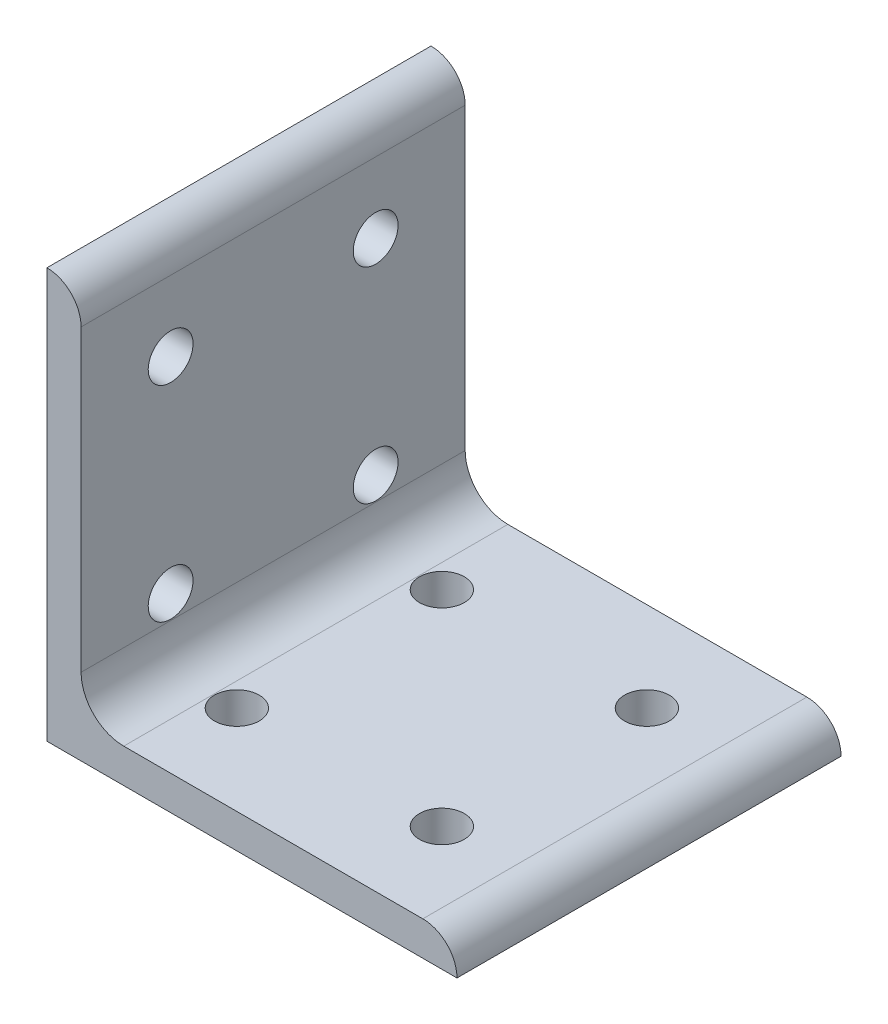
ISO-10303-21;
HEADER;
FILE_DESCRIPTION(('STEP AP214'),'2;1');
FILE_NAME('part.step','',(''),(''),'','','');
FILE_SCHEMA(('AUTOMOTIVE_DESIGN { 1 0 10303 214 1 1 1 1 }'));
ENDSEC;
DATA;
#1=APPLICATION_CONTEXT('core data for automotive mechanical design processes');
#2=APPLICATION_PROTOCOL_DEFINITION('international standard','automotive_design',2000,#1);
#3=PRODUCT_CONTEXT('',#1,'mechanical');
#4=PRODUCT('Part','Part','',(#3));
#5=PRODUCT_RELATED_PRODUCT_CATEGORY('part','',(#4));
#6=PRODUCT_DEFINITION_FORMATION('','',#4);
#7=PRODUCT_DEFINITION_CONTEXT('part definition',#1,'design');
#8=PRODUCT_DEFINITION('design','',#6,#7);
#9=PRODUCT_DEFINITION_SHAPE('','',#8);
#10=(LENGTH_UNIT() NAMED_UNIT(*) SI_UNIT(.MILLI.,.METRE.));
#11=(NAMED_UNIT(*) PLANE_ANGLE_UNIT() SI_UNIT($,.RADIAN.));
#12=(NAMED_UNIT(*) SI_UNIT($,.STERADIAN.) SOLID_ANGLE_UNIT());
#13=UNCERTAINTY_MEASURE_WITH_UNIT(LENGTH_MEASURE(1.E-05),#10,'distance_accuracy_value','');
#14=(GEOMETRIC_REPRESENTATION_CONTEXT(3) GLOBAL_UNCERTAINTY_ASSIGNED_CONTEXT((#13)) GLOBAL_UNIT_ASSIGNED_CONTEXT((#10,
#11,#12)) REPRESENTATION_CONTEXT('',''));
#15=CARTESIAN_POINT('',(0.,0.,0.));
#16=DIRECTION('',(0.,0.,1.));
#17=DIRECTION('',(1.,0.,0.));
#18=AXIS2_PLACEMENT_3D('',#15,#16,#17);
#19=CARTESIAN_POINT('',(6.35,69.85,35.687));
#20=DIRECTION('',(-1.,0.,0.));
#21=DIRECTION('',(0.,-1.,0.));
#22=AXIS2_PLACEMENT_3D('',#19,#20,#21);
#23=PLANE('',#22);
#24=CARTESIAN_POINT('',(6.34999999999999,18.653125,-19.05));
#25=DIRECTION('',(-1.,0.,0.));
#26=DIRECTION('',(0.,-1.,0.));
#27=AXIS2_PLACEMENT_3D('',#24,#25,#26);
#28=CIRCLE('',#27,4.1656);
#29=CARTESIAN_POINT('',(6.35,14.487525,-19.05));
#30=VERTEX_POINT('',#29);
#31=EDGE_CURVE('E211',#30,#30,#28,.F.);
#32=ORIENTED_EDGE('',*,*,#31,.F.);
#33=EDGE_LOOP('',(#32));
#34=FACE_BOUND('',#33,.T.);
#35=CARTESIAN_POINT('',(6.34999999999999,18.653125,19.05));
#36=DIRECTION('',(-1.,0.,0.));
#37=DIRECTION('',(0.,-1.,0.));
#38=AXIS2_PLACEMENT_3D('',#35,#36,#37);
#39=CIRCLE('',#38,4.1656);
#40=CARTESIAN_POINT('',(6.35,14.487525,19.05));
#41=VERTEX_POINT('',#40);
#42=EDGE_CURVE('E220',#41,#41,#39,.F.);
#43=ORIENTED_EDGE('',*,*,#42,.F.);
#44=EDGE_LOOP('',(#43));
#45=FACE_BOUND('',#44,.T.);
#46=DIRECTION('',(0.,1.,0.));
#47=VECTOR('',#46,1.);
#48=CARTESIAN_POINT('',(6.35,69.85,-35.687));
#49=LINE('',#48,#47);
#50=CARTESIAN_POINT('',(6.35,14.2748,-35.687));
#51=VERTEX_POINT('',#50);
#52=CARTESIAN_POINT('',(6.35,69.85,-35.687));
#53=VERTEX_POINT('',#52);
#54=EDGE_CURVE('E115',#51,#53,#49,.T.);
#55=ORIENTED_EDGE('',*,*,#54,.T.);
#56=DIRECTION('',(0.,0.,-1.));
#57=VECTOR('',#56,1.);
#58=CARTESIAN_POINT('',(6.35,69.85,35.687));
#59=LINE('',#58,#57);
#60=CARTESIAN_POINT('',(6.35,69.85,35.687));
#61=VERTEX_POINT('',#60);
#62=EDGE_CURVE('E112',#61,#53,#59,.T.);
#63=ORIENTED_EDGE('',*,*,#62,.F.);
#64=DIRECTION('',(0.,1.,0.));
#65=VECTOR('',#64,1.);
#66=CARTESIAN_POINT('',(6.35,69.85,35.687));
#67=LINE('',#66,#65);
#68=CARTESIAN_POINT('',(6.35,14.2748,35.687));
#69=VERTEX_POINT('',#68);
#70=EDGE_CURVE('E101',#69,#61,#67,.T.);
#71=ORIENTED_EDGE('',*,*,#70,.F.);
#72=DIRECTION('',(0.,0.,-1.));
#73=VECTOR('',#72,1.);
#74=CARTESIAN_POINT('',(6.35,14.2748,35.687));
#75=LINE('',#74,#73);
#76=EDGE_CURVE('E116',#69,#51,#75,.T.);
#77=ORIENTED_EDGE('',*,*,#76,.T.);
#78=EDGE_LOOP('',(#55,#63,#71,#77));
#79=FACE_BOUND('',#78,.T.);
#80=CARTESIAN_POINT('',(6.34999999999999,56.753125,19.05));
#81=DIRECTION('',(-1.,0.,0.));
#82=DIRECTION('',(0.,-1.,0.));
#83=AXIS2_PLACEMENT_3D('',#80,#81,#82);
#84=CIRCLE('',#83,4.1656);
#85=CARTESIAN_POINT('',(6.35,52.587525,19.05));
#86=VERTEX_POINT('',#85);
#87=EDGE_CURVE('E215',#86,#86,#84,.F.);
#88=ORIENTED_EDGE('',*,*,#87,.F.);
#89=EDGE_LOOP('',(#88));
#90=FACE_BOUND('',#89,.T.);
#91=CARTESIAN_POINT('',(6.34999999999999,56.753125,-19.05));
#92=DIRECTION('',(-1.,0.,0.));
#93=DIRECTION('',(0.,-1.,0.));
#94=AXIS2_PLACEMENT_3D('',#91,#92,#93);
#95=CIRCLE('',#94,4.1656);
#96=CARTESIAN_POINT('',(6.35,52.587525,-19.05));
#97=VERTEX_POINT('',#96);
#98=EDGE_CURVE('E203',#97,#97,#95,.F.);
#99=ORIENTED_EDGE('',*,*,#98,.F.);
#100=EDGE_LOOP('',(#99));
#101=FACE_BOUND('',#100,.T.);
#102=ADVANCED_FACE('F32',(#34,#45,#79,#90,#101),#23,.F.);
#103=CARTESIAN_POINT('',(0.,0.,35.687));
#104=DIRECTION('',(1.,0.,0.));
#105=DIRECTION('',(0.,0.,-1.));
#106=AXIS2_PLACEMENT_3D('',#103,#104,#105);
#107=PLANE('',#106);
#108=CARTESIAN_POINT('',(0.,18.653125,-19.05));
#109=DIRECTION('',(1.,0.,0.));
#110=DIRECTION('',(0.,0.,-1.));
#111=AXIS2_PLACEMENT_3D('',#108,#109,#110);
#112=CIRCLE('',#111,4.1656);
#113=CARTESIAN_POINT('',(0.,18.653125,-23.2156));
#114=VERTEX_POINT('',#113);
#115=EDGE_CURVE('E206',#114,#114,#112,.T.);
#116=ORIENTED_EDGE('',*,*,#115,.T.);
#117=EDGE_LOOP('',(#116));
#118=FACE_BOUND('',#117,.T.);
#119=CARTESIAN_POINT('',(0.,18.653125,19.05));
#120=DIRECTION('',(1.,0.,0.));
#121=DIRECTION('',(0.,0.,-1.));
#122=AXIS2_PLACEMENT_3D('',#119,#120,#121);
#123=CIRCLE('',#122,4.1656);
#124=CARTESIAN_POINT('',(0.,18.653125,14.8844));
#125=VERTEX_POINT('',#124);
#126=EDGE_CURVE('E218',#125,#125,#123,.T.);
#127=ORIENTED_EDGE('',*,*,#126,.T.);
#128=EDGE_LOOP('',(#127));
#129=FACE_BOUND('',#128,.T.);
#130=DIRECTION('',(0.,-1.,0.));
#131=VECTOR('',#130,1.);
#132=CARTESIAN_POINT('',(0.,0.,-35.687));
#133=LINE('',#132,#131);
#134=CARTESIAN_POINT('',(0.,76.2,-35.687));
#135=VERTEX_POINT('',#134);
#136=CARTESIAN_POINT('',(0.,0.,-35.687));
#137=VERTEX_POINT('',#136);
#138=EDGE_CURVE('E83',#135,#137,#133,.T.);
#139=ORIENTED_EDGE('',*,*,#138,.T.);
#140=DIRECTION('',(0.,0.,-1.));
#141=VECTOR('',#140,1.);
#142=CARTESIAN_POINT('',(0.,0.,35.687));
#143=LINE('',#142,#141);
#144=CARTESIAN_POINT('',(0.,0.,35.687));
#145=VERTEX_POINT('',#144);
#146=EDGE_CURVE('E121',#145,#137,#143,.T.);
#147=ORIENTED_EDGE('',*,*,#146,.F.);
#148=DIRECTION('',(0.,-1.,0.));
#149=VECTOR('',#148,1.);
#150=CARTESIAN_POINT('',(0.,0.,35.687));
#151=LINE('',#150,#149);
#152=CARTESIAN_POINT('',(0.,76.2,35.687));
#153=VERTEX_POINT('',#152);
#154=EDGE_CURVE('E51',#153,#145,#151,.T.);
#155=ORIENTED_EDGE('',*,*,#154,.F.);
#156=DIRECTION('',(0.,0.,-1.));
#157=VECTOR('',#156,1.);
#158=CARTESIAN_POINT('',(0.,76.2,35.687));
#159=LINE('',#158,#157);
#160=EDGE_CURVE('E117',#153,#135,#159,.T.);
#161=ORIENTED_EDGE('',*,*,#160,.T.);
#162=EDGE_LOOP('',(#139,#147,#155,#161));
#163=FACE_BOUND('',#162,.T.);
#164=CARTESIAN_POINT('',(0.,56.753125,19.05));
#165=DIRECTION('',(1.,0.,0.));
#166=DIRECTION('',(0.,0.,-1.));
#167=AXIS2_PLACEMENT_3D('',#164,#165,#166);
#168=CIRCLE('',#167,4.1656);
#169=CARTESIAN_POINT('',(0.,56.753125,14.8844));
#170=VERTEX_POINT('',#169);
#171=EDGE_CURVE('E198',#170,#170,#168,.T.);
#172=ORIENTED_EDGE('',*,*,#171,.T.);
#173=EDGE_LOOP('',(#172));
#174=FACE_BOUND('',#173,.T.);
#175=CARTESIAN_POINT('',(0.,56.753125,-19.05));
#176=DIRECTION('',(1.,0.,0.));
#177=DIRECTION('',(0.,0.,-1.));
#178=AXIS2_PLACEMENT_3D('',#175,#176,#177);
#179=CIRCLE('',#178,4.1656);
#180=CARTESIAN_POINT('',(0.,56.753125,-23.2156));
#181=VERTEX_POINT('',#180);
#182=EDGE_CURVE('E201',#181,#181,#179,.T.);
#183=ORIENTED_EDGE('',*,*,#182,.T.);
#184=EDGE_LOOP('',(#183));
#185=FACE_BOUND('',#184,.T.);
#186=ADVANCED_FACE('F190',(#118,#129,#163,#174,#185),#107,.F.);
#187=CARTESIAN_POINT('',(76.2,0.,35.687));
#188=DIRECTION('',(0.,1.,0.));
#189=DIRECTION('',(-1.,0.,0.));
#190=AXIS2_PLACEMENT_3D('',#187,#188,#189);
#191=PLANE('',#190);
#192=CARTESIAN_POINT('',(18.653125,0.,-19.05));
#193=DIRECTION('',(0.,1.,0.));
#194=DIRECTION('',(0.,0.,1.));
#195=AXIS2_PLACEMENT_3D('',#192,#193,#194);
#196=CIRCLE('',#195,4.1656);
#197=CARTESIAN_POINT('',(18.653125,0.,-23.2156));
#198=VERTEX_POINT('',#197);
#199=EDGE_CURVE('E155',#198,#198,#196,.T.);
#200=ORIENTED_EDGE('',*,*,#199,.T.);
#201=EDGE_LOOP('',(#200));
#202=FACE_BOUND('',#201,.T.);
#203=CARTESIAN_POINT('',(18.653125,0.,19.05));
#204=DIRECTION('',(0.,1.,0.));
#205=DIRECTION('',(0.,0.,1.));
#206=AXIS2_PLACEMENT_3D('',#203,#204,#205);
#207=CIRCLE('',#206,4.1656);
#208=CARTESIAN_POINT('',(18.653125,0.,14.8844));
#209=VERTEX_POINT('',#208);
#210=EDGE_CURVE('E149',#209,#209,#207,.T.);
#211=ORIENTED_EDGE('',*,*,#210,.T.);
#212=EDGE_LOOP('',(#211));
#213=FACE_BOUND('',#212,.T.);
#214=DIRECTION('',(1.,0.,0.));
#215=VECTOR('',#214,1.);
#216=CARTESIAN_POINT('',(76.2,0.,-35.687));
#217=LINE('',#216,#215);
#218=CARTESIAN_POINT('',(76.2,0.,-35.687));
#219=VERTEX_POINT('',#218);
#220=EDGE_CURVE('E125',#137,#219,#217,.T.);
#221=ORIENTED_EDGE('',*,*,#220,.T.);
#222=DIRECTION('',(0.,0.,-1.));
#223=VECTOR('',#222,1.);
#224=CARTESIAN_POINT('',(76.2,0.,35.687));
#225=LINE('',#224,#223);
#226=CARTESIAN_POINT('',(76.2,0.,35.687));
#227=VERTEX_POINT('',#226);
#228=EDGE_CURVE('E11',#227,#219,#225,.T.);
#229=ORIENTED_EDGE('',*,*,#228,.F.);
#230=DIRECTION('',(1.,0.,0.));
#231=VECTOR('',#230,1.);
#232=CARTESIAN_POINT('',(76.2,0.,35.687));
#233=LINE('',#232,#231);
#234=EDGE_CURVE('E138',#145,#227,#233,.T.);
#235=ORIENTED_EDGE('',*,*,#234,.F.);
#236=ORIENTED_EDGE('',*,*,#146,.T.);
#237=EDGE_LOOP('',(#221,#229,#235,#236));
#238=FACE_BOUND('',#237,.T.);
#239=CARTESIAN_POINT('',(56.753125,0.,19.05));
#240=DIRECTION('',(0.,1.,0.));
#241=DIRECTION('',(0.,0.,1.));
#242=AXIS2_PLACEMENT_3D('',#239,#240,#241);
#243=CIRCLE('',#242,4.1656);
#244=CARTESIAN_POINT('',(56.753125,0.,14.8844));
#245=VERTEX_POINT('',#244);
#246=EDGE_CURVE('E152',#245,#245,#243,.T.);
#247=ORIENTED_EDGE('',*,*,#246,.T.);
#248=EDGE_LOOP('',(#247));
#249=FACE_BOUND('',#248,.T.);
#250=CARTESIAN_POINT('',(56.753125,0.,-19.05));
#251=DIRECTION('',(0.,1.,0.));
#252=DIRECTION('',(0.,0.,1.));
#253=AXIS2_PLACEMENT_3D('',#250,#251,#252);
#254=CIRCLE('',#253,4.1656);
#255=CARTESIAN_POINT('',(56.753125,0.,-23.2156));
#256=VERTEX_POINT('',#255);
#257=EDGE_CURVE('E165',#256,#256,#254,.T.);
#258=ORIENTED_EDGE('',*,*,#257,.T.);
#259=EDGE_LOOP('',(#258));
#260=FACE_BOUND('',#259,.T.);
#261=ADVANCED_FACE('F34',(#202,#213,#238,#249,#260),#191,.F.);
#262=CARTESIAN_POINT('',(14.2748,6.35,35.687));
#263=DIRECTION('',(0.,-1.,0.));
#264=DIRECTION('',(1.,0.,0.));
#265=AXIS2_PLACEMENT_3D('',#262,#263,#264);
#266=PLANE('',#265);
#267=CARTESIAN_POINT('',(18.653125,6.35000000000001,-19.05));
#268=DIRECTION('',(0.,-1.,0.));
#269=DIRECTION('',(1.,0.,0.));
#270=AXIS2_PLACEMENT_3D('',#267,#268,#269);
#271=CIRCLE('',#270,4.1656);
#272=CARTESIAN_POINT('',(18.653125,6.35000000000002,-23.2156));
#273=VERTEX_POINT('',#272);
#274=EDGE_CURVE('E153',#273,#273,#271,.F.);
#275=ORIENTED_EDGE('',*,*,#274,.F.);
#276=EDGE_LOOP('',(#275));
#277=FACE_BOUND('',#276,.T.);
#278=CARTESIAN_POINT('',(18.653125,6.35000000000001,19.05));
#279=DIRECTION('',(0.,-1.,0.));
#280=DIRECTION('',(1.,0.,0.));
#281=AXIS2_PLACEMENT_3D('',#278,#279,#280);
#282=CIRCLE('',#281,4.1656);
#283=CARTESIAN_POINT('',(18.653125,6.35000000000002,14.8844));
#284=VERTEX_POINT('',#283);
#285=EDGE_CURVE('E129',#284,#284,#282,.F.);
#286=ORIENTED_EDGE('',*,*,#285,.F.);
#287=EDGE_LOOP('',(#286));
#288=FACE_BOUND('',#287,.T.);
#289=DIRECTION('',(-1.,0.,0.));
#290=VECTOR('',#289,1.);
#291=CARTESIAN_POINT('',(14.2748,6.35,-35.687));
#292=LINE('',#291,#290);
#293=CARTESIAN_POINT('',(69.85,6.35,-35.687));
#294=VERTEX_POINT('',#293);
#295=CARTESIAN_POINT('',(14.2748,6.35,-35.687));
#296=VERTEX_POINT('',#295);
#297=EDGE_CURVE('E131',#294,#296,#292,.T.);
#298=ORIENTED_EDGE('',*,*,#297,.T.);
#299=DIRECTION('',(0.,0.,-1.));
#300=VECTOR('',#299,1.);
#301=CARTESIAN_POINT('',(14.2748,6.35,35.687));
#302=LINE('',#301,#300);
#303=CARTESIAN_POINT('',(14.2748,6.35,35.687));
#304=VERTEX_POINT('',#303);
#305=EDGE_CURVE('E142',#304,#296,#302,.T.);
#306=ORIENTED_EDGE('',*,*,#305,.F.);
#307=DIRECTION('',(-1.,0.,0.));
#308=VECTOR('',#307,1.);
#309=CARTESIAN_POINT('',(14.2748,6.35,35.687));
#310=LINE('',#309,#308);
#311=CARTESIAN_POINT('',(69.85,6.35,35.687));
#312=VERTEX_POINT('',#311);
#313=EDGE_CURVE('E173',#312,#304,#310,.T.);
#314=ORIENTED_EDGE('',*,*,#313,.F.);
#315=DIRECTION('',(0.,0.,-1.));
#316=VECTOR('',#315,1.);
#317=CARTESIAN_POINT('',(69.85,6.35,35.687));
#318=LINE('',#317,#316);
#319=EDGE_CURVE('E42',#312,#294,#318,.T.);
#320=ORIENTED_EDGE('',*,*,#319,.T.);
#321=EDGE_LOOP('',(#298,#306,#314,#320));
#322=FACE_BOUND('',#321,.T.);
#323=CARTESIAN_POINT('',(56.753125,6.35000000000001,19.05));
#324=DIRECTION('',(0.,-1.,0.));
#325=DIRECTION('',(1.,0.,0.));
#326=AXIS2_PLACEMENT_3D('',#323,#324,#325);
#327=CIRCLE('',#326,4.1656);
#328=CARTESIAN_POINT('',(56.753125,6.35000000000002,14.8844));
#329=VERTEX_POINT('',#328);
#330=EDGE_CURVE('E150',#329,#329,#327,.F.);
#331=ORIENTED_EDGE('',*,*,#330,.F.);
#332=EDGE_LOOP('',(#331));
#333=FACE_BOUND('',#332,.T.);
#334=CARTESIAN_POINT('',(56.753125,6.35000000000001,-19.05));
#335=DIRECTION('',(0.,-1.,0.));
#336=DIRECTION('',(1.,0.,0.));
#337=AXIS2_PLACEMENT_3D('',#334,#335,#336);
#338=CIRCLE('',#337,4.1656);
#339=CARTESIAN_POINT('',(56.753125,6.35000000000002,-23.2156));
#340=VERTEX_POINT('',#339);
#341=EDGE_CURVE('E36',#340,#340,#338,.F.);
#342=ORIENTED_EDGE('',*,*,#341,.F.);
#343=EDGE_LOOP('',(#342));
#344=FACE_BOUND('',#343,.T.);
#345=ADVANCED_FACE('F177',(#277,#288,#322,#333,#344),#266,.F.);
#346=CARTESIAN_POINT('',(69.85,0.,35.687));
#347=DIRECTION('',(0.,0.,-1.));
#348=DIRECTION('',(-1.,0.,0.));
#349=AXIS2_PLACEMENT_3D('',#346,#347,#348);
#350=CYLINDRICAL_SURFACE('',#349,6.35000000000001);
#351=CARTESIAN_POINT('',(69.85,0.,-35.687));
#352=DIRECTION('',(0.,0.,1.));
#353=DIRECTION('',(1.,0.,0.));
#354=AXIS2_PLACEMENT_3D('',#351,#352,#353);
#355=CIRCLE('',#354,6.35000000000001);
#356=EDGE_CURVE('E128',#219,#294,#355,.T.);
#357=ORIENTED_EDGE('',*,*,#356,.T.);
#358=ORIENTED_EDGE('',*,*,#319,.F.);
#359=CARTESIAN_POINT('',(69.85,0.,35.687));
#360=DIRECTION('',(0.,0.,1.));
#361=DIRECTION('',(1.,0.,0.));
#362=AXIS2_PLACEMENT_3D('',#359,#360,#361);
#363=CIRCLE('',#362,6.35000000000001);
#364=EDGE_CURVE('E91',#227,#312,#363,.T.);
#365=ORIENTED_EDGE('',*,*,#364,.F.);
#366=ORIENTED_EDGE('',*,*,#228,.T.);
#367=EDGE_LOOP('',(#357,#358,#365,#366));
#368=FACE_BOUND('',#367,.T.);
#369=ADVANCED_FACE('F237',(#368),#350,.T.);
#370=CARTESIAN_POINT('',(14.2748,14.2748,35.687));
#371=DIRECTION('',(0.,0.,-1.));
#372=DIRECTION('',(-1.,0.,0.));
#373=AXIS2_PLACEMENT_3D('',#370,#371,#372);
#374=CYLINDRICAL_SURFACE('',#373,7.9248);
#375=CARTESIAN_POINT('',(14.2748,14.2748,-35.687));
#376=DIRECTION('',(0.,0.,-1.));
#377=DIRECTION('',(1.,0.,0.));
#378=AXIS2_PLACEMENT_3D('',#375,#376,#377);
#379=CIRCLE('',#378,7.9248);
#380=EDGE_CURVE('E133',#296,#51,#379,.T.);
#381=ORIENTED_EDGE('',*,*,#380,.T.);
#382=ORIENTED_EDGE('',*,*,#76,.F.);
#383=CARTESIAN_POINT('',(14.2748,14.2748,35.687));
#384=DIRECTION('',(0.,0.,-1.));
#385=DIRECTION('',(1.,0.,0.));
#386=AXIS2_PLACEMENT_3D('',#383,#384,#385);
#387=CIRCLE('',#386,7.9248);
#388=EDGE_CURVE('E107',#304,#69,#387,.T.);
#389=ORIENTED_EDGE('',*,*,#388,.F.);
#390=ORIENTED_EDGE('',*,*,#305,.T.);
#391=EDGE_LOOP('',(#381,#382,#389,#390));
#392=FACE_BOUND('',#391,.T.);
#393=ADVANCED_FACE('F182',(#392),#374,.F.);
#394=CARTESIAN_POINT('',(0.,69.85,35.687));
#395=DIRECTION('',(0.,0.,-1.));
#396=DIRECTION('',(-1.,0.,0.));
#397=AXIS2_PLACEMENT_3D('',#394,#395,#396);
#398=CYLINDRICAL_SURFACE('',#397,6.35000000000001);
#399=CARTESIAN_POINT('',(0.,69.85,-35.687));
#400=DIRECTION('',(0.,0.,1.));
#401=DIRECTION('',(1.,0.,0.));
#402=AXIS2_PLACEMENT_3D('',#399,#400,#401);
#403=CIRCLE('',#402,6.35000000000001);
#404=EDGE_CURVE('E77',#53,#135,#403,.T.);
#405=ORIENTED_EDGE('',*,*,#404,.T.);
#406=ORIENTED_EDGE('',*,*,#160,.F.);
#407=CARTESIAN_POINT('',(0.,69.85,35.687));
#408=DIRECTION('',(0.,0.,1.));
#409=DIRECTION('',(1.,0.,0.));
#410=AXIS2_PLACEMENT_3D('',#407,#408,#409);
#411=CIRCLE('',#410,6.35000000000001);
#412=EDGE_CURVE('E105',#61,#153,#411,.T.);
#413=ORIENTED_EDGE('',*,*,#412,.F.);
#414=ORIENTED_EDGE('',*,*,#62,.T.);
#415=EDGE_LOOP('',(#405,#406,#413,#414));
#416=FACE_BOUND('',#415,.T.);
#417=ADVANCED_FACE('F119',(#416),#398,.T.);
#418=CARTESIAN_POINT('',(0.,69.85,35.687));
#419=DIRECTION('',(0.,0.,1.));
#420=DIRECTION('',(1.,0.,0.));
#421=AXIS2_PLACEMENT_3D('',#418,#419,#420);
#422=PLANE('',#421);
#423=ORIENTED_EDGE('',*,*,#234,.T.);
#424=ORIENTED_EDGE('',*,*,#364,.T.);
#425=ORIENTED_EDGE('',*,*,#313,.T.);
#426=ORIENTED_EDGE('',*,*,#388,.T.);
#427=ORIENTED_EDGE('',*,*,#70,.T.);
#428=ORIENTED_EDGE('',*,*,#412,.T.);
#429=ORIENTED_EDGE('',*,*,#154,.T.);
#430=EDGE_LOOP('',(#423,#424,#425,#426,#427,#428,#429));
#431=FACE_BOUND('',#430,.T.);
#432=ADVANCED_FACE('F103',(#431),#422,.T.);
#433=CARTESIAN_POINT('',(0.,69.85,-35.687));
#434=DIRECTION('',(0.,0.,1.));
#435=DIRECTION('',(1.,0.,0.));
#436=AXIS2_PLACEMENT_3D('',#433,#434,#435);
#437=PLANE('',#436);
#438=ORIENTED_EDGE('',*,*,#220,.F.);
#439=ORIENTED_EDGE('',*,*,#138,.F.);
#440=ORIENTED_EDGE('',*,*,#404,.F.);
#441=ORIENTED_EDGE('',*,*,#54,.F.);
#442=ORIENTED_EDGE('',*,*,#380,.F.);
#443=ORIENTED_EDGE('',*,*,#297,.F.);
#444=ORIENTED_EDGE('',*,*,#356,.F.);
#445=EDGE_LOOP('',(#438,#439,#440,#441,#442,#443,#444));
#446=FACE_BOUND('',#445,.T.);
#447=ADVANCED_FACE('F185',(#446),#437,.F.);
#448=CARTESIAN_POINT('',(18.653125,76.2,19.05));
#449=DIRECTION('',(0.,-1.,0.));
#450=DIRECTION('',(0.,0.,-1.));
#451=AXIS2_PLACEMENT_3D('',#448,#449,#450);
#452=CYLINDRICAL_SURFACE('',#451,4.1656);
#453=CARTESIAN_POINT('',(18.653125,0.,14.8844));
#454=CARTESIAN_POINT('',(18.653125,0.0661458333333318,14.8844));
#455=CARTESIAN_POINT('',(18.653125,0.132291666666664,14.8844));
#456=CARTESIAN_POINT('',(18.653125,0.264583333333332,14.8844));
#457=CARTESIAN_POINT('',(18.653125,0.330729166666668,14.8844));
#458=CARTESIAN_POINT('',(18.653125,0.463020833333337,14.8844));
#459=CARTESIAN_POINT('',(18.653125,0.529166666666669,14.8844));
#460=CARTESIAN_POINT('',(18.653125,0.661458333333337,14.8844));
#461=CARTESIAN_POINT('',(18.653125,0.727604166666673,14.8844));
#462=CARTESIAN_POINT('',(18.653125,0.859895833333342,14.8844));
#463=CARTESIAN_POINT('',(18.653125,0.926041666666673,14.8844));
#464=CARTESIAN_POINT('',(18.653125,1.05833333333334,14.8844));
#465=CARTESIAN_POINT('',(18.653125,1.12447916666667,14.8844));
#466=CARTESIAN_POINT('',(18.653125,1.25677083333334,14.8844));
#467=CARTESIAN_POINT('',(18.653125,1.32291666666667,14.8844));
#468=CARTESIAN_POINT('',(18.653125,1.45520833333334,14.8844));
#469=CARTESIAN_POINT('',(18.653125,1.52135416666667,14.8844));
#470=CARTESIAN_POINT('',(18.653125,1.65364583333334,14.8844));
#471=CARTESIAN_POINT('',(18.653125,1.71979166666667,14.8844));
#472=CARTESIAN_POINT('',(18.653125,1.85208333333334,14.8844));
#473=CARTESIAN_POINT('',(18.653125,1.91822916666667,14.8844));
#474=CARTESIAN_POINT('',(18.653125,2.05052083333334,14.8844));
#475=CARTESIAN_POINT('',(18.653125,2.11666666666667,14.8844));
#476=CARTESIAN_POINT('',(18.653125,2.24895833333334,14.8844));
#477=CARTESIAN_POINT('',(18.653125,2.31510416666667,14.8844));
#478=CARTESIAN_POINT('',(18.653125,2.44739583333334,14.8844));
#479=CARTESIAN_POINT('',(18.653125,2.51354166666667,14.8844));
#480=CARTESIAN_POINT('',(18.653125,2.64583333333334,14.8844));
#481=CARTESIAN_POINT('',(18.653125,2.71197916666667,14.8844));
#482=CARTESIAN_POINT('',(18.653125,2.84427083333334,14.8844));
#483=CARTESIAN_POINT('',(18.653125,2.91041666666668,14.8844));
#484=CARTESIAN_POINT('',(18.653125,3.04270833333335,14.8844));
#485=CARTESIAN_POINT('',(18.653125,3.10885416666668,14.8844));
#486=CARTESIAN_POINT('',(18.653125,3.24114583333334,14.8844));
#487=CARTESIAN_POINT('',(18.653125,3.30729166666667,14.8844));
#488=CARTESIAN_POINT('',(18.653125,3.43958333333334,14.8844));
#489=CARTESIAN_POINT('',(18.653125,3.50572916666668,14.8844));
#490=CARTESIAN_POINT('',(18.653125,3.63802083333335,14.8844));
#491=CARTESIAN_POINT('',(18.653125,3.70416666666668,14.8844));
#492=CARTESIAN_POINT('',(18.653125,3.83645833333335,14.8844));
#493=CARTESIAN_POINT('',(18.653125,3.90260416666668,14.8844));
#494=CARTESIAN_POINT('',(18.653125,4.03489583333335,14.8844));
#495=CARTESIAN_POINT('',(18.653125,4.10104166666668,14.8844));
#496=CARTESIAN_POINT('',(18.653125,4.23333333333335,14.8844));
#497=CARTESIAN_POINT('',(18.653125,4.29947916666668,14.8844));
#498=CARTESIAN_POINT('',(18.653125,4.43177083333335,14.8844));
#499=CARTESIAN_POINT('',(18.653125,4.49791666666668,14.8844));
#500=CARTESIAN_POINT('',(18.653125,4.63020833333335,14.8844));
#501=CARTESIAN_POINT('',(18.653125,4.69635416666668,14.8844));
#502=CARTESIAN_POINT('',(18.653125,4.82864583333335,14.8844));
#503=CARTESIAN_POINT('',(18.653125,4.89479166666668,14.8844));
#504=CARTESIAN_POINT('',(18.653125,5.02708333333335,14.8844));
#505=CARTESIAN_POINT('',(18.653125,5.09322916666668,14.8844));
#506=CARTESIAN_POINT('',(18.653125,5.22552083333335,14.8844));
#507=CARTESIAN_POINT('',(18.653125,5.29166666666668,14.8844));
#508=CARTESIAN_POINT('',(18.653125,5.42395833333335,14.8844));
#509=CARTESIAN_POINT('',(18.653125,5.49010416666668,14.8844));
#510=CARTESIAN_POINT('',(18.653125,5.62239583333335,14.8844));
#511=CARTESIAN_POINT('',(18.653125,5.68854166666669,14.8844));
#512=CARTESIAN_POINT('',(18.653125,5.82083333333335,14.8844));
#513=CARTESIAN_POINT('',(18.653125,5.88697916666669,14.8844));
#514=CARTESIAN_POINT('',(18.653125,6.01927083333335,14.8844));
#515=CARTESIAN_POINT('',(18.653125,6.08541666666669,14.8844));
#516=CARTESIAN_POINT('',(18.653125,6.21770833333336,14.8844));
#517=CARTESIAN_POINT('',(18.653125,6.28385416666669,14.8844));
#518=CARTESIAN_POINT('',(18.653125,6.35000000000002,14.8844));
#519=B_SPLINE_CURVE_WITH_KNOTS('',3,(#453,#454,#455,#456,#457,#458,#459,#460,#461,#462,#463,
#464,#465,#466,#467,#468,#469,#470,#471,#472,#473,#474,#475,#476,#477,#478,#479,#480,#481,#482,
#483,#484,#485,#486,#487,#488,#489,#490,#491,#492,#493,#494,#495,#496,#497,#498,#499,#500,#501,
#502,#503,#504,#505,#506,#507,#508,#509,#510,#511,#512,#513,#514,#515,#516,#517,#518),
.UNSPECIFIED.,.F.,.F.,(4,2,2,2,2,2,2,2,2,2,2,2,2,2,2,2,2,2,2,2,2,2,2,2,2,2,2,2,2,2,2,2,4),(0.,
0.198437499999995,0.396875000000005,0.5953125,0.79375000000001,0.992187500000005,1.190625,
1.38906250000001,1.58750000000001,1.7859375,1.98437500000001,2.18281250000001,2.38125,
2.57968750000001,2.77812500000001,2.97656250000002,3.17500000000001,3.37343750000001,
3.57187500000002,3.77031250000001,3.96875000000002,4.16718750000002,4.36562500000001,
4.56406250000002,4.76250000000002,4.96093750000001,5.15937500000002,5.35781250000002,
5.55625000000001,5.75468750000002,5.95312500000002,6.15156250000003,6.35000000000002),.UNSPECIFIED.);
#520=EDGE_CURVE('BSEAM265',#209,#284,#519,.T.);
#521=ORIENTED_EDGE('',*,*,#210,.F.);
#522=ORIENTED_EDGE('',*,*,#285,.T.);
#523=ORIENTED_EDGE('',*,*,#520,.T.);
#524=ORIENTED_EDGE('',*,*,#520,.F.);
#525=EDGE_LOOP('',(#521,#523,#522,#524));
#526=FACE_BOUND('',#525,.T.);
#527=ADVANCED_FACE('F265',(#526),#452,.F.);
#528=CARTESIAN_POINT('',(56.753125,76.2,19.05));
#529=DIRECTION('',(0.,-1.,0.));
#530=DIRECTION('',(0.,0.,-1.));
#531=AXIS2_PLACEMENT_3D('',#528,#529,#530);
#532=CYLINDRICAL_SURFACE('',#531,4.1656);
#533=CARTESIAN_POINT('',(56.753125,0.,14.8844));
#534=CARTESIAN_POINT('',(56.753125,0.0661458333333318,14.8844));
#535=CARTESIAN_POINT('',(56.753125,0.132291666666664,14.8844));
#536=CARTESIAN_POINT('',(56.753125,0.264583333333332,14.8844));
#537=CARTESIAN_POINT('',(56.753125,0.330729166666668,14.8844));
#538=CARTESIAN_POINT('',(56.753125,0.463020833333337,14.8844));
#539=CARTESIAN_POINT('',(56.753125,0.529166666666669,14.8844));
#540=CARTESIAN_POINT('',(56.753125,0.661458333333337,14.8844));
#541=CARTESIAN_POINT('',(56.753125,0.727604166666673,14.8844));
#542=CARTESIAN_POINT('',(56.753125,0.859895833333342,14.8844));
#543=CARTESIAN_POINT('',(56.753125,0.926041666666673,14.8844));
#544=CARTESIAN_POINT('',(56.753125,1.05833333333334,14.8844));
#545=CARTESIAN_POINT('',(56.753125,1.12447916666667,14.8844));
#546=CARTESIAN_POINT('',(56.753125,1.25677083333334,14.8844));
#547=CARTESIAN_POINT('',(56.753125,1.32291666666667,14.8844));
#548=CARTESIAN_POINT('',(56.753125,1.45520833333334,14.8844));
#549=CARTESIAN_POINT('',(56.753125,1.52135416666667,14.8844));
#550=CARTESIAN_POINT('',(56.753125,1.65364583333334,14.8844));
#551=CARTESIAN_POINT('',(56.753125,1.71979166666667,14.8844));
#552=CARTESIAN_POINT('',(56.753125,1.85208333333334,14.8844));
#553=CARTESIAN_POINT('',(56.753125,1.91822916666667,14.8844));
#554=CARTESIAN_POINT('',(56.753125,2.05052083333334,14.8844));
#555=CARTESIAN_POINT('',(56.753125,2.11666666666667,14.8844));
#556=CARTESIAN_POINT('',(56.753125,2.24895833333334,14.8844));
#557=CARTESIAN_POINT('',(56.753125,2.31510416666667,14.8844));
#558=CARTESIAN_POINT('',(56.753125,2.44739583333334,14.8844));
#559=CARTESIAN_POINT('',(56.753125,2.51354166666667,14.8844));
#560=CARTESIAN_POINT('',(56.753125,2.64583333333334,14.8844));
#561=CARTESIAN_POINT('',(56.753125,2.71197916666667,14.8844));
#562=CARTESIAN_POINT('',(56.753125,2.84427083333334,14.8844));
#563=CARTESIAN_POINT('',(56.753125,2.91041666666668,14.8844));
#564=CARTESIAN_POINT('',(56.753125,3.04270833333335,14.8844));
#565=CARTESIAN_POINT('',(56.753125,3.10885416666668,14.8844));
#566=CARTESIAN_POINT('',(56.753125,3.24114583333334,14.8844));
#567=CARTESIAN_POINT('',(56.753125,3.30729166666667,14.8844));
#568=CARTESIAN_POINT('',(56.753125,3.43958333333334,14.8844));
#569=CARTESIAN_POINT('',(56.753125,3.50572916666668,14.8844));
#570=CARTESIAN_POINT('',(56.753125,3.63802083333335,14.8844));
#571=CARTESIAN_POINT('',(56.753125,3.70416666666668,14.8844));
#572=CARTESIAN_POINT('',(56.753125,3.83645833333335,14.8844));
#573=CARTESIAN_POINT('',(56.753125,3.90260416666668,14.8844));
#574=CARTESIAN_POINT('',(56.753125,4.03489583333335,14.8844));
#575=CARTESIAN_POINT('',(56.753125,4.10104166666668,14.8844));
#576=CARTESIAN_POINT('',(56.753125,4.23333333333335,14.8844));
#577=CARTESIAN_POINT('',(56.753125,4.29947916666668,14.8844));
#578=CARTESIAN_POINT('',(56.753125,4.43177083333335,14.8844));
#579=CARTESIAN_POINT('',(56.753125,4.49791666666668,14.8844));
#580=CARTESIAN_POINT('',(56.753125,4.63020833333335,14.8844));
#581=CARTESIAN_POINT('',(56.753125,4.69635416666668,14.8844));
#582=CARTESIAN_POINT('',(56.753125,4.82864583333335,14.8844));
#583=CARTESIAN_POINT('',(56.753125,4.89479166666668,14.8844));
#584=CARTESIAN_POINT('',(56.753125,5.02708333333335,14.8844));
#585=CARTESIAN_POINT('',(56.753125,5.09322916666668,14.8844));
#586=CARTESIAN_POINT('',(56.753125,5.22552083333335,14.8844));
#587=CARTESIAN_POINT('',(56.753125,5.29166666666668,14.8844));
#588=CARTESIAN_POINT('',(56.753125,5.42395833333335,14.8844));
#589=CARTESIAN_POINT('',(56.753125,5.49010416666668,14.8844));
#590=CARTESIAN_POINT('',(56.753125,5.62239583333335,14.8844));
#591=CARTESIAN_POINT('',(56.753125,5.68854166666669,14.8844));
#592=CARTESIAN_POINT('',(56.753125,5.82083333333335,14.8844));
#593=CARTESIAN_POINT('',(56.753125,5.88697916666669,14.8844));
#594=CARTESIAN_POINT('',(56.753125,6.01927083333335,14.8844));
#595=CARTESIAN_POINT('',(56.753125,6.08541666666669,14.8844));
#596=CARTESIAN_POINT('',(56.753125,6.21770833333336,14.8844));
#597=CARTESIAN_POINT('',(56.753125,6.28385416666669,14.8844));
#598=CARTESIAN_POINT('',(56.753125,6.35000000000002,14.8844));
#599=B_SPLINE_CURVE_WITH_KNOTS('',3,(#533,#534,#535,#536,#537,#538,#539,#540,#541,#542,#543,
#544,#545,#546,#547,#548,#549,#550,#551,#552,#553,#554,#555,#556,#557,#558,#559,#560,#561,#562,
#563,#564,#565,#566,#567,#568,#569,#570,#571,#572,#573,#574,#575,#576,#577,#578,#579,#580,#581,
#582,#583,#584,#585,#586,#587,#588,#589,#590,#591,#592,#593,#594,#595,#596,#597,#598),
.UNSPECIFIED.,.F.,.F.,(4,2,2,2,2,2,2,2,2,2,2,2,2,2,2,2,2,2,2,2,2,2,2,2,2,2,2,2,2,2,2,2,4),(0.,
0.198437499999995,0.396875000000005,0.5953125,0.79375000000001,0.992187500000005,1.190625,
1.38906250000001,1.58750000000001,1.7859375,1.98437500000001,2.18281250000001,2.38125,
2.57968750000001,2.77812500000001,2.97656250000002,3.17500000000001,3.37343750000001,
3.57187500000002,3.77031250000001,3.96875000000002,4.16718750000002,4.36562500000001,
4.56406250000002,4.76250000000002,4.96093750000001,5.15937500000002,5.35781250000002,
5.55625000000001,5.75468750000002,5.95312500000002,6.15156250000003,6.35000000000002),.UNSPECIFIED.);
#600=EDGE_CURVE('BSEAM270',#245,#329,#599,.T.);
#601=ORIENTED_EDGE('',*,*,#246,.F.);
#602=ORIENTED_EDGE('',*,*,#330,.T.);
#603=ORIENTED_EDGE('',*,*,#600,.T.);
#604=ORIENTED_EDGE('',*,*,#600,.F.);
#605=EDGE_LOOP('',(#601,#603,#602,#604));
#606=FACE_BOUND('',#605,.T.);
#607=ADVANCED_FACE('F270',(#606),#532,.F.);
#608=CARTESIAN_POINT('',(18.653125,76.2,-19.05));
#609=DIRECTION('',(0.,-1.,0.));
#610=DIRECTION('',(0.,0.,-1.));
#611=AXIS2_PLACEMENT_3D('',#608,#609,#610);
#612=CYLINDRICAL_SURFACE('',#611,4.1656);
#613=CARTESIAN_POINT('',(18.653125,0.,-23.2156));
#614=CARTESIAN_POINT('',(18.653125,0.0661458333333318,-23.2156));
#615=CARTESIAN_POINT('',(18.653125,0.132291666666664,-23.2156));
#616=CARTESIAN_POINT('',(18.653125,0.264583333333332,-23.2156));
#617=CARTESIAN_POINT('',(18.653125,0.330729166666668,-23.2156));
#618=CARTESIAN_POINT('',(18.653125,0.463020833333337,-23.2156));
#619=CARTESIAN_POINT('',(18.653125,0.529166666666669,-23.2156));
#620=CARTESIAN_POINT('',(18.653125,0.661458333333337,-23.2156));
#621=CARTESIAN_POINT('',(18.653125,0.727604166666673,-23.2156));
#622=CARTESIAN_POINT('',(18.653125,0.859895833333342,-23.2156));
#623=CARTESIAN_POINT('',(18.653125,0.926041666666673,-23.2156));
#624=CARTESIAN_POINT('',(18.653125,1.05833333333334,-23.2156));
#625=CARTESIAN_POINT('',(18.653125,1.12447916666667,-23.2156));
#626=CARTESIAN_POINT('',(18.653125,1.25677083333334,-23.2156));
#627=CARTESIAN_POINT('',(18.653125,1.32291666666667,-23.2156));
#628=CARTESIAN_POINT('',(18.653125,1.45520833333334,-23.2156));
#629=CARTESIAN_POINT('',(18.653125,1.52135416666667,-23.2156));
#630=CARTESIAN_POINT('',(18.653125,1.65364583333334,-23.2156));
#631=CARTESIAN_POINT('',(18.653125,1.71979166666667,-23.2156));
#632=CARTESIAN_POINT('',(18.653125,1.85208333333334,-23.2156));
#633=CARTESIAN_POINT('',(18.653125,1.91822916666667,-23.2156));
#634=CARTESIAN_POINT('',(18.653125,2.05052083333334,-23.2156));
#635=CARTESIAN_POINT('',(18.653125,2.11666666666667,-23.2156));
#636=CARTESIAN_POINT('',(18.653125,2.24895833333334,-23.2156));
#637=CARTESIAN_POINT('',(18.653125,2.31510416666667,-23.2156));
#638=CARTESIAN_POINT('',(18.653125,2.44739583333334,-23.2156));
#639=CARTESIAN_POINT('',(18.653125,2.51354166666667,-23.2156));
#640=CARTESIAN_POINT('',(18.653125,2.64583333333334,-23.2156));
#641=CARTESIAN_POINT('',(18.653125,2.71197916666667,-23.2156));
#642=CARTESIAN_POINT('',(18.653125,2.84427083333334,-23.2156));
#643=CARTESIAN_POINT('',(18.653125,2.91041666666668,-23.2156));
#644=CARTESIAN_POINT('',(18.653125,3.04270833333335,-23.2156));
#645=CARTESIAN_POINT('',(18.653125,3.10885416666668,-23.2156));
#646=CARTESIAN_POINT('',(18.653125,3.24114583333334,-23.2156));
#647=CARTESIAN_POINT('',(18.653125,3.30729166666667,-23.2156));
#648=CARTESIAN_POINT('',(18.653125,3.43958333333334,-23.2156));
#649=CARTESIAN_POINT('',(18.653125,3.50572916666668,-23.2156));
#650=CARTESIAN_POINT('',(18.653125,3.63802083333335,-23.2156));
#651=CARTESIAN_POINT('',(18.653125,3.70416666666668,-23.2156));
#652=CARTESIAN_POINT('',(18.653125,3.83645833333335,-23.2156));
#653=CARTESIAN_POINT('',(18.653125,3.90260416666668,-23.2156));
#654=CARTESIAN_POINT('',(18.653125,4.03489583333335,-23.2156));
#655=CARTESIAN_POINT('',(18.653125,4.10104166666668,-23.2156));
#656=CARTESIAN_POINT('',(18.653125,4.23333333333335,-23.2156));
#657=CARTESIAN_POINT('',(18.653125,4.29947916666668,-23.2156));
#658=CARTESIAN_POINT('',(18.653125,4.43177083333335,-23.2156));
#659=CARTESIAN_POINT('',(18.653125,4.49791666666668,-23.2156));
#660=CARTESIAN_POINT('',(18.653125,4.63020833333335,-23.2156));
#661=CARTESIAN_POINT('',(18.653125,4.69635416666668,-23.2156));
#662=CARTESIAN_POINT('',(18.653125,4.82864583333335,-23.2156));
#663=CARTESIAN_POINT('',(18.653125,4.89479166666668,-23.2156));
#664=CARTESIAN_POINT('',(18.653125,5.02708333333335,-23.2156));
#665=CARTESIAN_POINT('',(18.653125,5.09322916666668,-23.2156));
#666=CARTESIAN_POINT('',(18.653125,5.22552083333335,-23.2156));
#667=CARTESIAN_POINT('',(18.653125,5.29166666666668,-23.2156));
#668=CARTESIAN_POINT('',(18.653125,5.42395833333335,-23.2156));
#669=CARTESIAN_POINT('',(18.653125,5.49010416666668,-23.2156));
#670=CARTESIAN_POINT('',(18.653125,5.62239583333335,-23.2156));
#671=CARTESIAN_POINT('',(18.653125,5.68854166666669,-23.2156));
#672=CARTESIAN_POINT('',(18.653125,5.82083333333335,-23.2156));
#673=CARTESIAN_POINT('',(18.653125,5.88697916666669,-23.2156));
#674=CARTESIAN_POINT('',(18.653125,6.01927083333335,-23.2156));
#675=CARTESIAN_POINT('',(18.653125,6.08541666666669,-23.2156));
#676=CARTESIAN_POINT('',(18.653125,6.21770833333336,-23.2156));
#677=CARTESIAN_POINT('',(18.653125,6.28385416666669,-23.2156));
#678=CARTESIAN_POINT('',(18.653125,6.35000000000002,-23.2156));
#679=B_SPLINE_CURVE_WITH_KNOTS('',3,(#613,#614,#615,#616,#617,#618,#619,#620,#621,#622,#623,
#624,#625,#626,#627,#628,#629,#630,#631,#632,#633,#634,#635,#636,#637,#638,#639,#640,#641,#642,
#643,#644,#645,#646,#647,#648,#649,#650,#651,#652,#653,#654,#655,#656,#657,#658,#659,#660,#661,
#662,#663,#664,#665,#666,#667,#668,#669,#670,#671,#672,#673,#674,#675,#676,#677,#678),
.UNSPECIFIED.,.F.,.F.,(4,2,2,2,2,2,2,2,2,2,2,2,2,2,2,2,2,2,2,2,2,2,2,2,2,2,2,2,2,2,2,2,4),(0.,
0.198437499999995,0.396875000000005,0.5953125,0.79375000000001,0.992187500000005,1.190625,
1.38906250000001,1.58750000000001,1.7859375,1.98437500000001,2.18281250000001,2.38125,
2.57968750000001,2.77812500000001,2.97656250000002,3.17500000000001,3.37343750000001,
3.57187500000002,3.77031250000001,3.96875000000002,4.16718750000002,4.36562500000001,
4.56406250000002,4.76250000000002,4.96093750000001,5.15937500000002,5.35781250000002,
5.55625000000001,5.75468750000002,5.95312500000002,6.15156250000003,6.35000000000002),.UNSPECIFIED.);
#680=EDGE_CURVE('BSEAM232',#198,#273,#679,.T.);
#681=ORIENTED_EDGE('',*,*,#199,.F.);
#682=ORIENTED_EDGE('',*,*,#274,.T.);
#683=ORIENTED_EDGE('',*,*,#680,.T.);
#684=ORIENTED_EDGE('',*,*,#680,.F.);
#685=EDGE_LOOP('',(#681,#683,#682,#684));
#686=FACE_BOUND('',#685,.T.);
#687=ADVANCED_FACE('F232',(#686),#612,.F.);
#688=CARTESIAN_POINT('',(56.753125,76.2,-19.05));
#689=DIRECTION('',(0.,-1.,0.));
#690=DIRECTION('',(0.,0.,-1.));
#691=AXIS2_PLACEMENT_3D('',#688,#689,#690);
#692=CYLINDRICAL_SURFACE('',#691,4.1656);
#693=CARTESIAN_POINT('',(56.753125,0.,-23.2156));
#694=CARTESIAN_POINT('',(56.753125,0.0661458333333318,-23.2156));
#695=CARTESIAN_POINT('',(56.753125,0.132291666666664,-23.2156));
#696=CARTESIAN_POINT('',(56.753125,0.264583333333332,-23.2156));
#697=CARTESIAN_POINT('',(56.753125,0.330729166666668,-23.2156));
#698=CARTESIAN_POINT('',(56.753125,0.463020833333337,-23.2156));
#699=CARTESIAN_POINT('',(56.753125,0.529166666666669,-23.2156));
#700=CARTESIAN_POINT('',(56.753125,0.661458333333337,-23.2156));
#701=CARTESIAN_POINT('',(56.753125,0.727604166666673,-23.2156));
#702=CARTESIAN_POINT('',(56.753125,0.859895833333342,-23.2156));
#703=CARTESIAN_POINT('',(56.753125,0.926041666666673,-23.2156));
#704=CARTESIAN_POINT('',(56.753125,1.05833333333334,-23.2156));
#705=CARTESIAN_POINT('',(56.753125,1.12447916666667,-23.2156));
#706=CARTESIAN_POINT('',(56.753125,1.25677083333334,-23.2156));
#707=CARTESIAN_POINT('',(56.753125,1.32291666666667,-23.2156));
#708=CARTESIAN_POINT('',(56.753125,1.45520833333334,-23.2156));
#709=CARTESIAN_POINT('',(56.753125,1.52135416666667,-23.2156));
#710=CARTESIAN_POINT('',(56.753125,1.65364583333334,-23.2156));
#711=CARTESIAN_POINT('',(56.753125,1.71979166666667,-23.2156));
#712=CARTESIAN_POINT('',(56.753125,1.85208333333334,-23.2156));
#713=CARTESIAN_POINT('',(56.753125,1.91822916666667,-23.2156));
#714=CARTESIAN_POINT('',(56.753125,2.05052083333334,-23.2156));
#715=CARTESIAN_POINT('',(56.753125,2.11666666666667,-23.2156));
#716=CARTESIAN_POINT('',(56.753125,2.24895833333334,-23.2156));
#717=CARTESIAN_POINT('',(56.753125,2.31510416666667,-23.2156));
#718=CARTESIAN_POINT('',(56.753125,2.44739583333334,-23.2156));
#719=CARTESIAN_POINT('',(56.753125,2.51354166666667,-23.2156));
#720=CARTESIAN_POINT('',(56.753125,2.64583333333334,-23.2156));
#721=CARTESIAN_POINT('',(56.753125,2.71197916666667,-23.2156));
#722=CARTESIAN_POINT('',(56.753125,2.84427083333334,-23.2156));
#723=CARTESIAN_POINT('',(56.753125,2.91041666666668,-23.2156));
#724=CARTESIAN_POINT('',(56.753125,3.04270833333335,-23.2156));
#725=CARTESIAN_POINT('',(56.753125,3.10885416666668,-23.2156));
#726=CARTESIAN_POINT('',(56.753125,3.24114583333334,-23.2156));
#727=CARTESIAN_POINT('',(56.753125,3.30729166666667,-23.2156));
#728=CARTESIAN_POINT('',(56.753125,3.43958333333334,-23.2156));
#729=CARTESIAN_POINT('',(56.753125,3.50572916666668,-23.2156));
#730=CARTESIAN_POINT('',(56.753125,3.63802083333335,-23.2156));
#731=CARTESIAN_POINT('',(56.753125,3.70416666666668,-23.2156));
#732=CARTESIAN_POINT('',(56.753125,3.83645833333335,-23.2156));
#733=CARTESIAN_POINT('',(56.753125,3.90260416666668,-23.2156));
#734=CARTESIAN_POINT('',(56.753125,4.03489583333335,-23.2156));
#735=CARTESIAN_POINT('',(56.753125,4.10104166666668,-23.2156));
#736=CARTESIAN_POINT('',(56.753125,4.23333333333335,-23.2156));
#737=CARTESIAN_POINT('',(56.753125,4.29947916666668,-23.2156));
#738=CARTESIAN_POINT('',(56.753125,4.43177083333335,-23.2156));
#739=CARTESIAN_POINT('',(56.753125,4.49791666666668,-23.2156));
#740=CARTESIAN_POINT('',(56.753125,4.63020833333335,-23.2156));
#741=CARTESIAN_POINT('',(56.753125,4.69635416666668,-23.2156));
#742=CARTESIAN_POINT('',(56.753125,4.82864583333335,-23.2156));
#743=CARTESIAN_POINT('',(56.753125,4.89479166666668,-23.2156));
#744=CARTESIAN_POINT('',(56.753125,5.02708333333335,-23.2156));
#745=CARTESIAN_POINT('',(56.753125,5.09322916666668,-23.2156));
#746=CARTESIAN_POINT('',(56.753125,5.22552083333335,-23.2156));
#747=CARTESIAN_POINT('',(56.753125,5.29166666666668,-23.2156));
#748=CARTESIAN_POINT('',(56.753125,5.42395833333335,-23.2156));
#749=CARTESIAN_POINT('',(56.753125,5.49010416666668,-23.2156));
#750=CARTESIAN_POINT('',(56.753125,5.62239583333335,-23.2156));
#751=CARTESIAN_POINT('',(56.753125,5.68854166666669,-23.2156));
#752=CARTESIAN_POINT('',(56.753125,5.82083333333335,-23.2156));
#753=CARTESIAN_POINT('',(56.753125,5.88697916666669,-23.2156));
#754=CARTESIAN_POINT('',(56.753125,6.01927083333335,-23.2156));
#755=CARTESIAN_POINT('',(56.753125,6.08541666666669,-23.2156));
#756=CARTESIAN_POINT('',(56.753125,6.21770833333336,-23.2156));
#757=CARTESIAN_POINT('',(56.753125,6.28385416666669,-23.2156));
#758=CARTESIAN_POINT('',(56.753125,6.35000000000002,-23.2156));
#759=B_SPLINE_CURVE_WITH_KNOTS('',3,(#693,#694,#695,#696,#697,#698,#699,#700,#701,#702,#703,
#704,#705,#706,#707,#708,#709,#710,#711,#712,#713,#714,#715,#716,#717,#718,#719,#720,#721,#722,
#723,#724,#725,#726,#727,#728,#729,#730,#731,#732,#733,#734,#735,#736,#737,#738,#739,#740,#741,
#742,#743,#744,#745,#746,#747,#748,#749,#750,#751,#752,#753,#754,#755,#756,#757,#758),
.UNSPECIFIED.,.F.,.F.,(4,2,2,2,2,2,2,2,2,2,2,2,2,2,2,2,2,2,2,2,2,2,2,2,2,2,2,2,2,2,2,2,4),(0.,
0.198437499999995,0.396875000000005,0.5953125,0.79375000000001,0.992187500000005,1.190625,
1.38906250000001,1.58750000000001,1.7859375,1.98437500000001,2.18281250000001,2.38125,
2.57968750000001,2.77812500000001,2.97656250000002,3.17500000000001,3.37343750000001,
3.57187500000002,3.77031250000001,3.96875000000002,4.16718750000002,4.36562500000001,
4.56406250000002,4.76250000000002,4.96093750000001,5.15937500000002,5.35781250000002,
5.55625000000001,5.75468750000002,5.95312500000002,6.15156250000003,6.35000000000002),.UNSPECIFIED.);
#760=EDGE_CURVE('BSEAM228',#256,#340,#759,.T.);
#761=ORIENTED_EDGE('',*,*,#257,.F.);
#762=ORIENTED_EDGE('',*,*,#341,.T.);
#763=ORIENTED_EDGE('',*,*,#760,.T.);
#764=ORIENTED_EDGE('',*,*,#760,.F.);
#765=EDGE_LOOP('',(#761,#763,#762,#764));
#766=FACE_BOUND('',#765,.T.);
#767=ADVANCED_FACE('F228',(#766),#692,.F.);
#768=CARTESIAN_POINT('',(76.2,18.653125,19.05));
#769=DIRECTION('',(-1.,0.,0.));
#770=DIRECTION('',(0.,0.,1.));
#771=AXIS2_PLACEMENT_3D('',#768,#769,#770);
#772=CYLINDRICAL_SURFACE('',#771,4.1656);
#773=ORIENTED_EDGE('',*,*,#126,.F.);
#774=EDGE_LOOP('',(#773));
#775=FACE_BOUND('',#774,.T.);
#776=ORIENTED_EDGE('',*,*,#42,.T.);
#777=EDGE_LOOP('',(#776));
#778=FACE_BOUND('',#777,.T.);
#779=ADVANCED_FACE('F231',(#775,#778),#772,.F.);
#780=CARTESIAN_POINT('',(76.2,56.753125,19.05));
#781=DIRECTION('',(-1.,0.,0.));
#782=DIRECTION('',(0.,0.,1.));
#783=AXIS2_PLACEMENT_3D('',#780,#781,#782);
#784=CYLINDRICAL_SURFACE('',#783,4.1656);
#785=ORIENTED_EDGE('',*,*,#171,.F.);
#786=EDGE_LOOP('',(#785));
#787=FACE_BOUND('',#786,.T.);
#788=ORIENTED_EDGE('',*,*,#87,.T.);
#789=EDGE_LOOP('',(#788));
#790=FACE_BOUND('',#789,.T.);
#791=ADVANCED_FACE('F280',(#787,#790),#784,.F.);
#792=CARTESIAN_POINT('',(76.2,18.653125,-19.05));
#793=DIRECTION('',(-1.,0.,0.));
#794=DIRECTION('',(0.,0.,1.));
#795=AXIS2_PLACEMENT_3D('',#792,#793,#794);
#796=CYLINDRICAL_SURFACE('',#795,4.1656);
#797=ORIENTED_EDGE('',*,*,#115,.F.);
#798=EDGE_LOOP('',(#797));
#799=FACE_BOUND('',#798,.T.);
#800=ORIENTED_EDGE('',*,*,#31,.T.);
#801=EDGE_LOOP('',(#800));
#802=FACE_BOUND('',#801,.T.);
#803=ADVANCED_FACE('F284',(#799,#802),#796,.F.);
#804=CARTESIAN_POINT('',(76.2,56.753125,-19.05));
#805=DIRECTION('',(-1.,0.,0.));
#806=DIRECTION('',(0.,0.,1.));
#807=AXIS2_PLACEMENT_3D('',#804,#805,#806);
#808=CYLINDRICAL_SURFACE('',#807,4.1656);
#809=ORIENTED_EDGE('',*,*,#182,.F.);
#810=EDGE_LOOP('',(#809));
#811=FACE_BOUND('',#810,.T.);
#812=ORIENTED_EDGE('',*,*,#98,.T.);
#813=EDGE_LOOP('',(#812));
#814=FACE_BOUND('',#813,.T.);
#815=ADVANCED_FACE('F288',(#811,#814),#808,.F.);
#816=CLOSED_SHELL('',(#102,#186,#261,#345,#369,#393,#417,#432,#447,#527,#607,#687,#767,#779,
#791,#803,#815));
#817=MANIFOLD_SOLID_BREP('B2',#816);
#818=ADVANCED_BREP_SHAPE_REPRESENTATION('',(#18,#817),#14);
#819=SHAPE_DEFINITION_REPRESENTATION(#9,#818);
ENDSEC;
END-ISO-10303-21;
